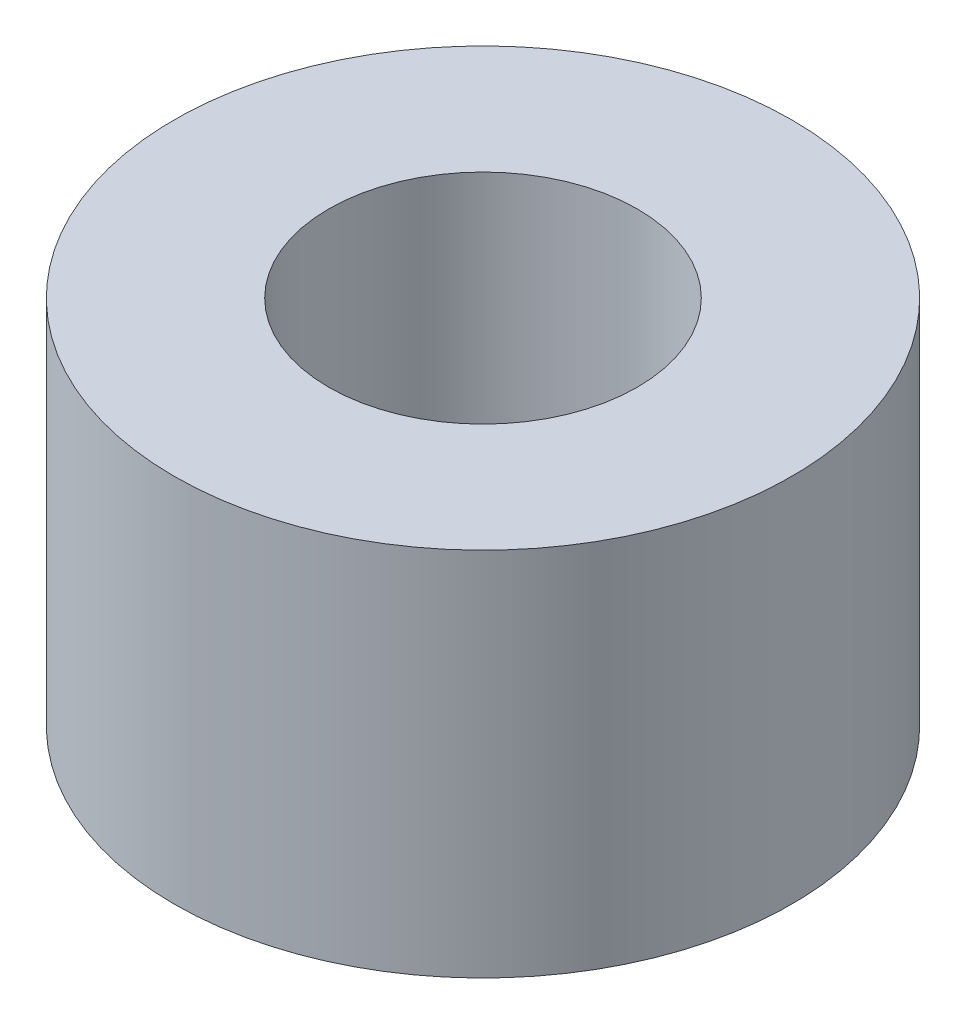
ISO-10303-21;
HEADER;
FILE_DESCRIPTION(('STEP AP214'),'2;1');
FILE_NAME('part.step','',(''),(''),'','','');
FILE_SCHEMA(('AUTOMOTIVE_DESIGN { 1 0 10303 214 1 1 1 1 }'));
ENDSEC;
DATA;
#1=APPLICATION_CONTEXT('core data for automotive mechanical design processes');
#2=APPLICATION_PROTOCOL_DEFINITION('international standard','automotive_design',2000,#1);
#3=PRODUCT_CONTEXT('',#1,'mechanical');
#4=PRODUCT('Part','Part','',(#3));
#5=PRODUCT_RELATED_PRODUCT_CATEGORY('part','',(#4));
#6=PRODUCT_DEFINITION_FORMATION('','',#4);
#7=PRODUCT_DEFINITION_CONTEXT('part definition',#1,'design');
#8=PRODUCT_DEFINITION('design','',#6,#7);
#9=PRODUCT_DEFINITION_SHAPE('','',#8);
#10=(LENGTH_UNIT() NAMED_UNIT(*) SI_UNIT(.MILLI.,.METRE.));
#11=(NAMED_UNIT(*) PLANE_ANGLE_UNIT() SI_UNIT($,.RADIAN.));
#12=(NAMED_UNIT(*) SI_UNIT($,.STERADIAN.) SOLID_ANGLE_UNIT());
#13=UNCERTAINTY_MEASURE_WITH_UNIT(LENGTH_MEASURE(1.E-05),#10,'distance_accuracy_value','');
#14=(GEOMETRIC_REPRESENTATION_CONTEXT(3) GLOBAL_UNCERTAINTY_ASSIGNED_CONTEXT((#13)) GLOBAL_UNIT_ASSIGNED_CONTEXT((#10,
#11,#12)) REPRESENTATION_CONTEXT('',''));
#15=CARTESIAN_POINT('',(0.,0.,0.));
#16=DIRECTION('',(0.,0.,1.));
#17=DIRECTION('',(1.,0.,0.));
#18=AXIS2_PLACEMENT_3D('',#15,#16,#17);
#19=CARTESIAN_POINT('',(0.,6.,0.));
#20=DIRECTION('',(0.,1.,0.));
#21=DIRECTION('',(0.,0.,1.));
#22=AXIS2_PLACEMENT_3D('',#19,#20,#21);
#23=PLANE('',#22);
#24=CARTESIAN_POINT('',(0.,6.,0.));
#25=DIRECTION('',(0.,1.,0.));
#26=DIRECTION('',(0.,0.,1.));
#27=AXIS2_PLACEMENT_3D('',#24,#25,#26);
#28=CIRCLE('',#27,5.);
#29=CARTESIAN_POINT('',(0.,6.,5.));
#30=VERTEX_POINT('',#29);
#31=EDGE_CURVE('E10',#30,#30,#28,.T.);
#32=ORIENTED_EDGE('',*,*,#31,.T.);
#33=EDGE_LOOP('',(#32));
#34=FACE_BOUND('',#33,.T.);
#35=CARTESIAN_POINT('',(0.,6.,0.));
#36=DIRECTION('',(0.,1.,0.));
#37=DIRECTION('',(0.,0.,1.));
#38=AXIS2_PLACEMENT_3D('',#35,#36,#37);
#39=CIRCLE('',#38,2.5);
#40=CARTESIAN_POINT('',(0.,6.,2.5));
#41=VERTEX_POINT('',#40);
#42=EDGE_CURVE('E42',#41,#41,#39,.T.);
#43=ORIENTED_EDGE('',*,*,#42,.F.);
#44=EDGE_LOOP('',(#43));
#45=FACE_BOUND('',#44,.T.);
#46=ADVANCED_FACE('F31',(#34,#45),#23,.T.);
#47=CARTESIAN_POINT('',(0.,0.,0.));
#48=DIRECTION('',(0.,1.,0.));
#49=DIRECTION('',(0.,0.,1.));
#50=AXIS2_PLACEMENT_3D('',#47,#48,#49);
#51=PLANE('',#50);
#52=CARTESIAN_POINT('',(0.,0.,0.));
#53=DIRECTION('',(0.,1.,0.));
#54=DIRECTION('',(0.,0.,1.));
#55=AXIS2_PLACEMENT_3D('',#52,#53,#54);
#56=CIRCLE('',#55,5.);
#57=CARTESIAN_POINT('',(0.,0.,5.));
#58=VERTEX_POINT('',#57);
#59=EDGE_CURVE('E35',#58,#58,#56,.T.);
#60=ORIENTED_EDGE('',*,*,#59,.F.);
#61=EDGE_LOOP('',(#60));
#62=FACE_BOUND('',#61,.T.);
#63=CARTESIAN_POINT('',(0.,0.,0.));
#64=DIRECTION('',(0.,1.,0.));
#65=DIRECTION('',(0.,0.,1.));
#66=AXIS2_PLACEMENT_3D('',#63,#64,#65);
#67=CIRCLE('',#66,2.5);
#68=CARTESIAN_POINT('',(0.,0.,2.5));
#69=VERTEX_POINT('',#68);
#70=EDGE_CURVE('E44',#69,#69,#67,.T.);
#71=ORIENTED_EDGE('',*,*,#70,.T.);
#72=EDGE_LOOP('',(#71));
#73=FACE_BOUND('',#72,.T.);
#74=ADVANCED_FACE('F54',(#62,#73),#51,.F.);
#75=CARTESIAN_POINT('',(0.,6.,0.));
#76=DIRECTION('',(0.,-1.,0.));
#77=DIRECTION('',(0.,0.,-1.));
#78=AXIS2_PLACEMENT_3D('',#75,#76,#77);
#79=CYLINDRICAL_SURFACE('',#78,5.);
#80=ORIENTED_EDGE('',*,*,#31,.F.);
#81=EDGE_LOOP('',(#80));
#82=FACE_BOUND('',#81,.T.);
#83=ORIENTED_EDGE('',*,*,#59,.T.);
#84=EDGE_LOOP('',(#83));
#85=FACE_BOUND('',#84,.T.);
#86=ADVANCED_FACE('F33',(#82,#85),#79,.T.);
#87=CARTESIAN_POINT('',(0.,6.,0.));
#88=DIRECTION('',(0.,-1.,0.));
#89=DIRECTION('',(0.,0.,-1.));
#90=AXIS2_PLACEMENT_3D('',#87,#88,#89);
#91=CYLINDRICAL_SURFACE('',#90,2.5);
#92=ORIENTED_EDGE('',*,*,#42,.T.);
#93=EDGE_LOOP('',(#92));
#94=FACE_BOUND('',#93,.T.);
#95=ORIENTED_EDGE('',*,*,#70,.F.);
#96=EDGE_LOOP('',(#95));
#97=FACE_BOUND('',#96,.T.);
#98=ADVANCED_FACE('F50',(#94,#97),#91,.F.);
#99=CLOSED_SHELL('',(#46,#74,#86,#98));
#100=MANIFOLD_SOLID_BREP('B2',#99);
#101=ADVANCED_BREP_SHAPE_REPRESENTATION('',(#18,#100),#14);
#102=SHAPE_DEFINITION_REPRESENTATION(#9,#101);
ENDSEC;
END-ISO-10303-21;
